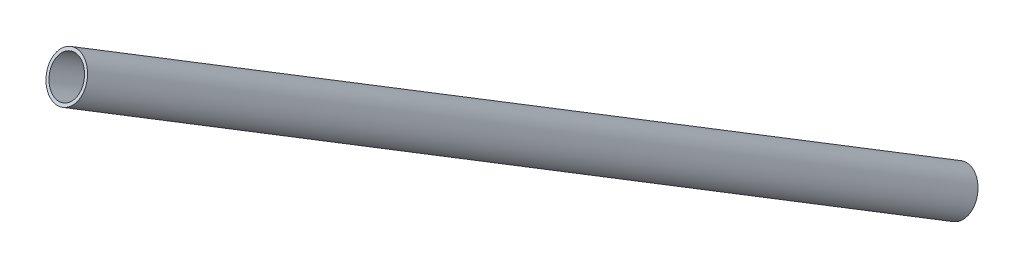
ISO-10303-21;
HEADER;
FILE_DESCRIPTION(('STEP AP214'),'2;1');
FILE_NAME('part.step','',(''),(''),'','','');
FILE_SCHEMA(('AUTOMOTIVE_DESIGN { 1 0 10303 214 1 1 1 1 }'));
ENDSEC;
DATA;
#1=APPLICATION_CONTEXT('core data for automotive mechanical design processes');
#2=APPLICATION_PROTOCOL_DEFINITION('international standard','automotive_design',2000,#1);
#3=PRODUCT_CONTEXT('',#1,'mechanical');
#4=PRODUCT('Part','Part','',(#3));
#5=PRODUCT_RELATED_PRODUCT_CATEGORY('part','',(#4));
#6=PRODUCT_DEFINITION_FORMATION('','',#4);
#7=PRODUCT_DEFINITION_CONTEXT('part definition',#1,'design');
#8=PRODUCT_DEFINITION('design','',#6,#7);
#9=PRODUCT_DEFINITION_SHAPE('','',#8);
#10=(LENGTH_UNIT() NAMED_UNIT(*) SI_UNIT(.MILLI.,.METRE.));
#11=(NAMED_UNIT(*) PLANE_ANGLE_UNIT() SI_UNIT($,.RADIAN.));
#12=(NAMED_UNIT(*) SI_UNIT($,.STERADIAN.) SOLID_ANGLE_UNIT());
#13=UNCERTAINTY_MEASURE_WITH_UNIT(LENGTH_MEASURE(1.E-05),#10,'distance_accuracy_value','');
#14=(GEOMETRIC_REPRESENTATION_CONTEXT(3) GLOBAL_UNCERTAINTY_ASSIGNED_CONTEXT((#13)) GLOBAL_UNIT_ASSIGNED_CONTEXT((#10,
#11,#12)) REPRESENTATION_CONTEXT('',''));
#15=CARTESIAN_POINT('',(0.,0.,0.));
#16=DIRECTION('',(0.,0.,1.));
#17=DIRECTION('',(1.,0.,0.));
#18=AXIS2_PLACEMENT_3D('',#15,#16,#17);
#19=CARTESIAN_POINT('',(-150.,0.,-825.));
#20=DIRECTION('',(-0.173785333909047,0.463427557090794,0.868926669545238));
#21=DIRECTION('',(0.,-0.882352941176471,0.470588235294118));
#22=AXIS2_PLACEMENT_3D('',#19,#20,#21);
#23=CYLINDRICAL_SURFACE('',#22,9.39999999999998);
#24=CARTESIAN_POINT('',(-150.,0.,-825.));
#25=DIRECTION('',(0.173785333909047,-0.463427557090794,-0.868926669545238));
#26=DIRECTION('',(0.643417681150066,-0.614550747865215,0.456443935091461));
#27=AXIS2_PLACEMENT_3D('',#24,#25,#26);
#28=CIRCLE('',#27,9.39999999999998);
#29=CARTESIAN_POINT('',(-143.951873797189,-5.77677702993306,-820.70942701014));
#30=VERTEX_POINT('',#29);
#31=EDGE_CURVE('E46',#30,#30,#28,.T.);
#32=ORIENTED_EDGE('',*,*,#31,.T.);
#33=EDGE_LOOP('',(#32));
#34=FACE_BOUND('',#33,.T.);
#35=CARTESIAN_POINT('',(-225.,200.,-450.));
#36=DIRECTION('',(0.173785333909047,-0.463427557090794,-0.868926669545238));
#37=DIRECTION('',(0.643417681150066,-0.614550747865215,0.456443935091461));
#38=AXIS2_PLACEMENT_3D('',#35,#36,#37);
#39=CIRCLE('',#38,9.39999999999998);
#40=CARTESIAN_POINT('',(-218.951873797189,194.223222970067,-445.70942701014));
#41=VERTEX_POINT('',#40);
#42=EDGE_CURVE('E52',#41,#41,#39,.T.);
#43=ORIENTED_EDGE('',*,*,#42,.F.);
#44=EDGE_LOOP('',(#43));
#45=FACE_BOUND('',#44,.T.);
#46=ADVANCED_FACE('F39',(#34,#45),#23,.F.);
#47=CARTESIAN_POINT('',(-150.,0.,-825.));
#48=DIRECTION('',(-0.173785333909047,0.463427557090794,0.868926669545238));
#49=DIRECTION('',(0.,-0.882352941176471,0.470588235294118));
#50=AXIS2_PLACEMENT_3D('',#47,#48,#49);
#51=CYLINDRICAL_SURFACE('',#50,11.);
#52=CARTESIAN_POINT('',(-150.,0.,-825.));
#53=DIRECTION('',(0.173785333909047,-0.463427557090794,-0.868926669545238));
#54=DIRECTION('',(0.643417681150066,-0.614550747865215,0.456443935091461));
#55=AXIS2_PLACEMENT_3D('',#52,#53,#54);
#56=CIRCLE('',#55,11.);
#57=CARTESIAN_POINT('',(-142.922405507349,-6.76005822651742,-819.979116713994));
#58=VERTEX_POINT('',#57);
#59=EDGE_CURVE('E10',#58,#58,#56,.T.);
#60=ORIENTED_EDGE('',*,*,#59,.F.);
#61=EDGE_LOOP('',(#60));
#62=FACE_BOUND('',#61,.T.);
#63=CARTESIAN_POINT('',(-225.,200.,-450.));
#64=DIRECTION('',(0.173785333909047,-0.463427557090794,-0.868926669545238));
#65=DIRECTION('',(0.643417681150066,-0.614550747865215,0.456443935091461));
#66=AXIS2_PLACEMENT_3D('',#63,#64,#65);
#67=CIRCLE('',#66,11.);
#68=CARTESIAN_POINT('',(-217.922405507349,193.239941773483,-444.979116713994));
#69=VERTEX_POINT('',#68);
#70=EDGE_CURVE('E42',#69,#69,#67,.T.);
#71=ORIENTED_EDGE('',*,*,#70,.T.);
#72=EDGE_LOOP('',(#71));
#73=FACE_BOUND('',#72,.T.);
#74=ADVANCED_FACE('F59',(#62,#73),#51,.T.);
#75=CARTESIAN_POINT('',(-150.,0.,-825.));
#76=DIRECTION('',(0.173785333909047,-0.463427557090794,-0.868926669545238));
#77=DIRECTION('',(0.643417681150066,-0.614550747865215,0.456443935091461));
#78=AXIS2_PLACEMENT_3D('',#75,#76,#77);
#79=PLANE('',#78);
#80=ORIENTED_EDGE('',*,*,#31,.F.);
#81=EDGE_LOOP('',(#80));
#82=FACE_BOUND('',#81,.T.);
#83=ORIENTED_EDGE('',*,*,#59,.T.);
#84=EDGE_LOOP('',(#83));
#85=FACE_BOUND('',#84,.T.);
#86=ADVANCED_FACE('F63',(#82,#85),#79,.T.);
#87=CARTESIAN_POINT('',(-225.,200.,-450.));
#88=DIRECTION('',(0.173785333909047,-0.463427557090794,-0.868926669545238));
#89=DIRECTION('',(0.643417681150066,-0.614550747865215,0.456443935091461));
#90=AXIS2_PLACEMENT_3D('',#87,#88,#89);
#91=PLANE('',#90);
#92=ORIENTED_EDGE('',*,*,#42,.T.);
#93=EDGE_LOOP('',(#92));
#94=FACE_BOUND('',#93,.T.);
#95=ORIENTED_EDGE('',*,*,#70,.F.);
#96=EDGE_LOOP('',(#95));
#97=FACE_BOUND('',#96,.T.);
#98=ADVANCED_FACE('F61',(#94,#97),#91,.F.);
#99=CLOSED_SHELL('',(#46,#74,#86,#98));
#100=MANIFOLD_SOLID_BREP('B2',#99);
#101=ADVANCED_BREP_SHAPE_REPRESENTATION('',(#18,#100),#14);
#102=SHAPE_DEFINITION_REPRESENTATION(#9,#101);
ENDSEC;
END-ISO-10303-21;
